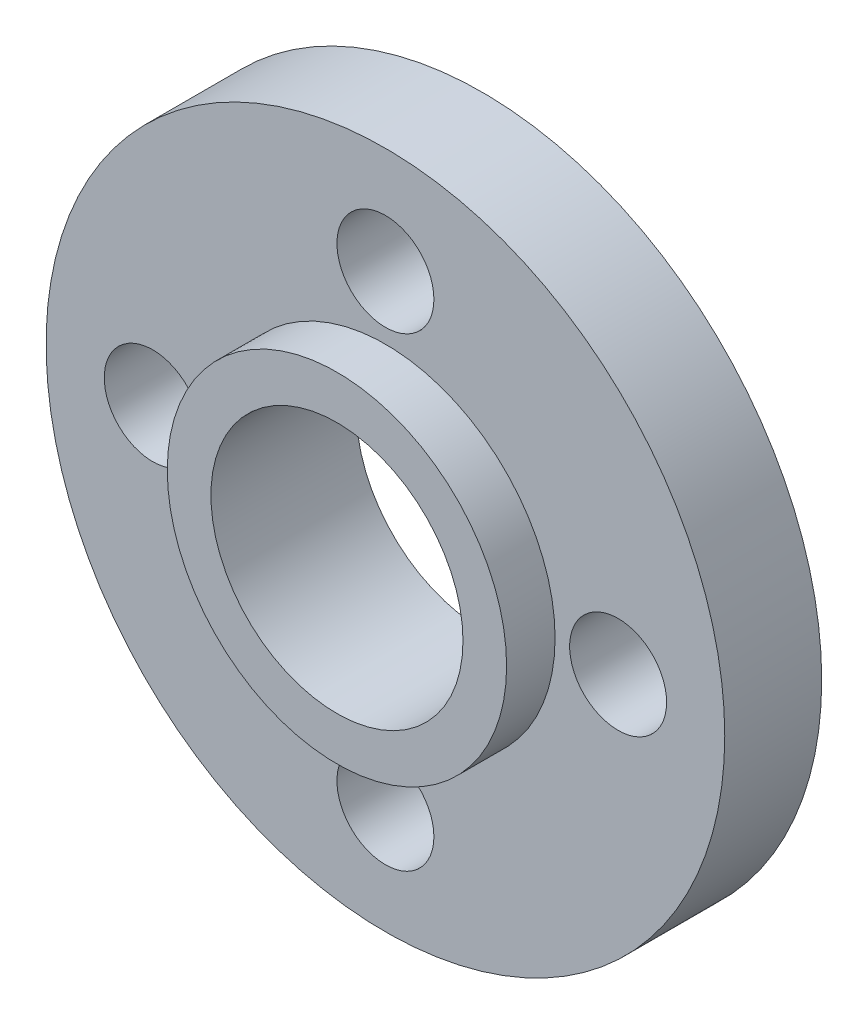
ISO-10303-21;
HEADER;
FILE_DESCRIPTION(('STEP AP214'),'2;1');
FILE_NAME('part.step','',(''),(''),'','','');
FILE_SCHEMA(('AUTOMOTIVE_DESIGN { 1 0 10303 214 1 1 1 1 }'));
ENDSEC;
DATA;
#1=APPLICATION_CONTEXT('core data for automotive mechanical design processes');
#2=APPLICATION_PROTOCOL_DEFINITION('international standard','automotive_design',2000,#1);
#3=PRODUCT_CONTEXT('',#1,'mechanical');
#4=PRODUCT('Part','Part','',(#3));
#5=PRODUCT_RELATED_PRODUCT_CATEGORY('part','',(#4));
#6=PRODUCT_DEFINITION_FORMATION('','',#4);
#7=PRODUCT_DEFINITION_CONTEXT('part definition',#1,'design');
#8=PRODUCT_DEFINITION('design','',#6,#7);
#9=PRODUCT_DEFINITION_SHAPE('','',#8);
#10=(LENGTH_UNIT() NAMED_UNIT(*) SI_UNIT(.MILLI.,.METRE.));
#11=(NAMED_UNIT(*) PLANE_ANGLE_UNIT() SI_UNIT($,.RADIAN.));
#12=(NAMED_UNIT(*) SI_UNIT($,.STERADIAN.) SOLID_ANGLE_UNIT());
#13=UNCERTAINTY_MEASURE_WITH_UNIT(LENGTH_MEASURE(1.E-05),#10,'distance_accuracy_value','');
#14=(GEOMETRIC_REPRESENTATION_CONTEXT(3) GLOBAL_UNCERTAINTY_ASSIGNED_CONTEXT((#13)) GLOBAL_UNIT_ASSIGNED_CONTEXT((#10,
#11,#12)) REPRESENTATION_CONTEXT('',''));
#15=CARTESIAN_POINT('',(0.,0.,0.));
#16=DIRECTION('',(0.,0.,1.));
#17=DIRECTION('',(1.,0.,0.));
#18=AXIS2_PLACEMENT_3D('',#15,#16,#17);
#19=CARTESIAN_POINT('',(0.,0.,2.));
#20=DIRECTION('',(0.,0.,1.));
#21=DIRECTION('',(1.,0.,0.));
#22=AXIS2_PLACEMENT_3D('',#19,#20,#21);
#23=PLANE('',#22);
#24=CARTESIAN_POINT('',(0.,0.,2.));
#25=DIRECTION('',(0.,0.,1.));
#26=DIRECTION('',(1.,0.,0.));
#27=AXIS2_PLACEMENT_3D('',#24,#25,#26);
#28=CIRCLE('',#27,3.5);
#29=CARTESIAN_POINT('',(3.5,0.,2.));
#30=VERTEX_POINT('',#29);
#31=EDGE_CURVE('E10',#30,#30,#28,.T.);
#32=ORIENTED_EDGE('',*,*,#31,.F.);
#33=EDGE_LOOP('',(#32));
#34=FACE_BOUND('',#33,.T.);
#35=CARTESIAN_POINT('',(4.8,0.,2.));
#36=DIRECTION('',(0.,0.,1.));
#37=DIRECTION('',(1.,0.,0.));
#38=AXIS2_PLACEMENT_3D('',#35,#36,#37);
#39=CIRCLE('',#38,0.999999999999998);
#40=CARTESIAN_POINT('',(5.8,0.,2.));
#41=VERTEX_POINT('',#40);
#42=EDGE_CURVE('E57',#41,#41,#39,.T.);
#43=ORIENTED_EDGE('',*,*,#42,.F.);
#44=EDGE_LOOP('',(#43));
#45=FACE_BOUND('',#44,.T.);
#46=CARTESIAN_POINT('',(-4.8,0.,2.));
#47=DIRECTION('',(0.,0.,1.));
#48=DIRECTION('',(1.,0.,0.));
#49=AXIS2_PLACEMENT_3D('',#46,#47,#48);
#50=CIRCLE('',#49,1.);
#51=CARTESIAN_POINT('',(-3.8,0.,2.));
#52=VERTEX_POINT('',#51);
#53=EDGE_CURVE('E69',#52,#52,#50,.T.);
#54=ORIENTED_EDGE('',*,*,#53,.F.);
#55=EDGE_LOOP('',(#54));
#56=FACE_BOUND('',#55,.T.);
#57=CARTESIAN_POINT('',(0.,0.,2.));
#58=DIRECTION('',(0.,0.,1.));
#59=DIRECTION('',(1.,0.,0.));
#60=AXIS2_PLACEMENT_3D('',#57,#58,#59);
#61=CIRCLE('',#60,7.);
#62=CARTESIAN_POINT('',(7.,0.,2.));
#63=VERTEX_POINT('',#62);
#64=EDGE_CURVE('E41',#63,#63,#61,.T.);
#65=ORIENTED_EDGE('',*,*,#64,.T.);
#66=EDGE_LOOP('',(#65));
#67=FACE_BOUND('',#66,.T.);
#68=CARTESIAN_POINT('',(0.,4.8,2.));
#69=DIRECTION('',(0.,0.,1.));
#70=DIRECTION('',(1.,0.,0.));
#71=AXIS2_PLACEMENT_3D('',#68,#69,#70);
#72=CIRCLE('',#71,1.);
#73=CARTESIAN_POINT('',(0.999999999999999,4.8,2.));
#74=VERTEX_POINT('',#73);
#75=EDGE_CURVE('E63',#74,#74,#72,.T.);
#76=ORIENTED_EDGE('',*,*,#75,.F.);
#77=EDGE_LOOP('',(#76));
#78=FACE_BOUND('',#77,.T.);
#79=CARTESIAN_POINT('',(0.,-4.8,2.));
#80=DIRECTION('',(0.,0.,1.));
#81=DIRECTION('',(1.,0.,0.));
#82=AXIS2_PLACEMENT_3D('',#79,#80,#81);
#83=CIRCLE('',#82,1.);
#84=CARTESIAN_POINT('',(1.,-4.8,2.));
#85=VERTEX_POINT('',#84);
#86=EDGE_CURVE('E50',#85,#85,#83,.T.);
#87=ORIENTED_EDGE('',*,*,#86,.F.);
#88=EDGE_LOOP('',(#87));
#89=FACE_BOUND('',#88,.T.);
#90=ADVANCED_FACE('F33',(#34,#45,#56,#67,#78,#89),#23,.T.);
#91=CARTESIAN_POINT('',(0.,0.,0.));
#92=DIRECTION('',(0.,0.,1.));
#93=DIRECTION('',(1.,0.,0.));
#94=AXIS2_PLACEMENT_3D('',#91,#92,#93);
#95=PLANE('',#94);
#96=CARTESIAN_POINT('',(0.,0.,0.));
#97=DIRECTION('',(0.,0.,1.));
#98=DIRECTION('',(1.,0.,0.));
#99=AXIS2_PLACEMENT_3D('',#96,#97,#98);
#100=CIRCLE('',#99,7.);
#101=CARTESIAN_POINT('',(7.,0.,0.));
#102=VERTEX_POINT('',#101);
#103=EDGE_CURVE('E37',#102,#102,#100,.T.);
#104=ORIENTED_EDGE('',*,*,#103,.F.);
#105=EDGE_LOOP('',(#104));
#106=FACE_BOUND('',#105,.T.);
#107=CARTESIAN_POINT('',(0.,0.,0.));
#108=DIRECTION('',(0.,0.,1.));
#109=DIRECTION('',(1.,0.,0.));
#110=AXIS2_PLACEMENT_3D('',#107,#108,#109);
#111=CIRCLE('',#110,2.6);
#112=CARTESIAN_POINT('',(2.6,0.,0.));
#113=VERTEX_POINT('',#112);
#114=EDGE_CURVE('E72',#113,#113,#111,.T.);
#115=ORIENTED_EDGE('',*,*,#114,.T.);
#116=EDGE_LOOP('',(#115));
#117=FACE_BOUND('',#116,.T.);
#118=CARTESIAN_POINT('',(-4.8,0.,0.));
#119=DIRECTION('',(0.,0.,1.));
#120=DIRECTION('',(1.,0.,0.));
#121=AXIS2_PLACEMENT_3D('',#118,#119,#120);
#122=CIRCLE('',#121,1.);
#123=CARTESIAN_POINT('',(-3.8,0.,0.));
#124=VERTEX_POINT('',#123);
#125=EDGE_CURVE('E66',#124,#124,#122,.T.);
#126=ORIENTED_EDGE('',*,*,#125,.T.);
#127=EDGE_LOOP('',(#126));
#128=FACE_BOUND('',#127,.T.);
#129=CARTESIAN_POINT('',(0.,4.8,0.));
#130=DIRECTION('',(0.,0.,1.));
#131=DIRECTION('',(1.,0.,0.));
#132=AXIS2_PLACEMENT_3D('',#129,#130,#131);
#133=CIRCLE('',#132,1.);
#134=CARTESIAN_POINT('',(0.999999999999999,4.8,0.));
#135=VERTEX_POINT('',#134);
#136=EDGE_CURVE('E60',#135,#135,#133,.T.);
#137=ORIENTED_EDGE('',*,*,#136,.T.);
#138=EDGE_LOOP('',(#137));
#139=FACE_BOUND('',#138,.T.);
#140=CARTESIAN_POINT('',(4.8,0.,0.));
#141=DIRECTION('',(0.,0.,1.));
#142=DIRECTION('',(1.,0.,0.));
#143=AXIS2_PLACEMENT_3D('',#140,#141,#142);
#144=CIRCLE('',#143,0.999999999999998);
#145=CARTESIAN_POINT('',(5.8,0.,0.));
#146=VERTEX_POINT('',#145);
#147=EDGE_CURVE('E53',#146,#146,#144,.T.);
#148=ORIENTED_EDGE('',*,*,#147,.T.);
#149=EDGE_LOOP('',(#148));
#150=FACE_BOUND('',#149,.T.);
#151=CARTESIAN_POINT('',(0.,-4.8,0.));
#152=DIRECTION('',(0.,0.,1.));
#153=DIRECTION('',(1.,0.,0.));
#154=AXIS2_PLACEMENT_3D('',#151,#152,#153);
#155=CIRCLE('',#154,1.);
#156=CARTESIAN_POINT('',(1.,-4.8,0.));
#157=VERTEX_POINT('',#156);
#158=EDGE_CURVE('E54',#157,#157,#155,.T.);
#159=ORIENTED_EDGE('',*,*,#158,.T.);
#160=EDGE_LOOP('',(#159));
#161=FACE_BOUND('',#160,.T.);
#162=ADVANCED_FACE('F82',(#106,#117,#128,#139,#150,#161),#95,.F.);
#163=CARTESIAN_POINT('',(0.,0.,2.));
#164=DIRECTION('',(0.,0.,-1.));
#165=DIRECTION('',(-1.,0.,0.));
#166=AXIS2_PLACEMENT_3D('',#163,#164,#165);
#167=CYLINDRICAL_SURFACE('',#166,7.);
#168=ORIENTED_EDGE('',*,*,#64,.F.);
#169=EDGE_LOOP('',(#168));
#170=FACE_BOUND('',#169,.T.);
#171=ORIENTED_EDGE('',*,*,#103,.T.);
#172=EDGE_LOOP('',(#171));
#173=FACE_BOUND('',#172,.T.);
#174=ADVANCED_FACE('F35',(#170,#173),#167,.T.);
#175=CARTESIAN_POINT('',(0.,0.,2.));
#176=DIRECTION('',(0.,0.,-1.));
#177=DIRECTION('',(-1.,0.,0.));
#178=AXIS2_PLACEMENT_3D('',#175,#176,#177);
#179=CYLINDRICAL_SURFACE('',#178,2.6);
#180=ORIENTED_EDGE('',*,*,#114,.F.);
#181=EDGE_LOOP('',(#180));
#182=FACE_BOUND('',#181,.T.);
#183=CARTESIAN_POINT('',(0.,0.,3.));
#184=DIRECTION('',(0.,0.,1.));
#185=DIRECTION('',(1.,0.,0.));
#186=AXIS2_PLACEMENT_3D('',#183,#184,#185);
#187=CIRCLE('',#186,2.6);
#188=CARTESIAN_POINT('',(2.6,0.,3.));
#189=VERTEX_POINT('',#188);
#190=EDGE_CURVE('E177',#189,#189,#187,.T.);
#191=ORIENTED_EDGE('',*,*,#190,.T.);
#192=EDGE_LOOP('',(#191));
#193=FACE_BOUND('',#192,.T.);
#194=ADVANCED_FACE('F117',(#182,#193),#179,.F.);
#195=CARTESIAN_POINT('',(-4.8,0.,2.));
#196=DIRECTION('',(0.,0.,-1.));
#197=DIRECTION('',(-1.,0.,0.));
#198=AXIS2_PLACEMENT_3D('',#195,#196,#197);
#199=CYLINDRICAL_SURFACE('',#198,1.);
#200=ORIENTED_EDGE('',*,*,#53,.T.);
#201=EDGE_LOOP('',(#200));
#202=FACE_BOUND('',#201,.T.);
#203=ORIENTED_EDGE('',*,*,#125,.F.);
#204=EDGE_LOOP('',(#203));
#205=FACE_BOUND('',#204,.T.);
#206=ADVANCED_FACE('F120',(#202,#205),#199,.F.);
#207=CARTESIAN_POINT('',(0.,4.8,2.));
#208=DIRECTION('',(0.,0.,-1.));
#209=DIRECTION('',(-1.,0.,0.));
#210=AXIS2_PLACEMENT_3D('',#207,#208,#209);
#211=CYLINDRICAL_SURFACE('',#210,1.);
#212=ORIENTED_EDGE('',*,*,#75,.T.);
#213=EDGE_LOOP('',(#212));
#214=FACE_BOUND('',#213,.T.);
#215=ORIENTED_EDGE('',*,*,#136,.F.);
#216=EDGE_LOOP('',(#215));
#217=FACE_BOUND('',#216,.T.);
#218=ADVANCED_FACE('F106',(#214,#217),#211,.F.);
#219=CARTESIAN_POINT('',(4.8,0.,2.));
#220=DIRECTION('',(0.,0.,-1.));
#221=DIRECTION('',(-1.,0.,0.));
#222=AXIS2_PLACEMENT_3D('',#219,#220,#221);
#223=CYLINDRICAL_SURFACE('',#222,0.999999999999998);
#224=ORIENTED_EDGE('',*,*,#42,.T.);
#225=EDGE_LOOP('',(#224));
#226=FACE_BOUND('',#225,.T.);
#227=ORIENTED_EDGE('',*,*,#147,.F.);
#228=EDGE_LOOP('',(#227));
#229=FACE_BOUND('',#228,.T.);
#230=ADVANCED_FACE('F96',(#226,#229),#223,.F.);
#231=CARTESIAN_POINT('',(0.,-4.8,2.));
#232=DIRECTION('',(0.,0.,-1.));
#233=DIRECTION('',(-1.,0.,0.));
#234=AXIS2_PLACEMENT_3D('',#231,#232,#233);
#235=CYLINDRICAL_SURFACE('',#234,1.);
#236=ORIENTED_EDGE('',*,*,#86,.T.);
#237=EDGE_LOOP('',(#236));
#238=FACE_BOUND('',#237,.T.);
#239=ORIENTED_EDGE('',*,*,#158,.F.);
#240=EDGE_LOOP('',(#239));
#241=FACE_BOUND('',#240,.T.);
#242=ADVANCED_FACE('F93',(#238,#241),#235,.F.);
#243=CARTESIAN_POINT('',(0.,0.,3.));
#244=DIRECTION('',(0.,0.,1.));
#245=DIRECTION('',(1.,0.,0.));
#246=AXIS2_PLACEMENT_3D('',#243,#244,#245);
#247=PLANE('',#246);
#248=CARTESIAN_POINT('',(0.,0.,3.));
#249=DIRECTION('',(0.,0.,1.));
#250=DIRECTION('',(1.,0.,0.));
#251=AXIS2_PLACEMENT_3D('',#248,#249,#250);
#252=CIRCLE('',#251,3.5);
#253=CARTESIAN_POINT('',(3.5,0.,3.));
#254=VERTEX_POINT('',#253);
#255=EDGE_CURVE('E48',#254,#254,#252,.T.);
#256=ORIENTED_EDGE('',*,*,#255,.T.);
#257=EDGE_LOOP('',(#256));
#258=FACE_BOUND('',#257,.T.);
#259=ORIENTED_EDGE('',*,*,#190,.F.);
#260=EDGE_LOOP('',(#259));
#261=FACE_BOUND('',#260,.T.);
#262=ADVANCED_FACE('F95',(#258,#261),#247,.T.);
#263=CARTESIAN_POINT('',(0.,0.,3.));
#264=DIRECTION('',(0.,0.,-1.));
#265=DIRECTION('',(-1.,0.,0.));
#266=AXIS2_PLACEMENT_3D('',#263,#264,#265);
#267=CYLINDRICAL_SURFACE('',#266,3.5);
#268=ORIENTED_EDGE('',*,*,#255,.F.);
#269=EDGE_LOOP('',(#268));
#270=FACE_BOUND('',#269,.T.);
#271=ORIENTED_EDGE('',*,*,#31,.T.);
#272=EDGE_LOOP('',(#271));
#273=FACE_BOUND('',#272,.T.);
#274=ADVANCED_FACE('F103',(#270,#273),#267,.T.);
#275=CLOSED_SHELL('',(#90,#162,#174,#194,#206,#218,#230,#242,#262,#274));
#276=MANIFOLD_SOLID_BREP('B2',#275);
#277=ADVANCED_BREP_SHAPE_REPRESENTATION('',(#18,#276),#14);
#278=SHAPE_DEFINITION_REPRESENTATION(#9,#277);
ENDSEC;
END-ISO-10303-21;
